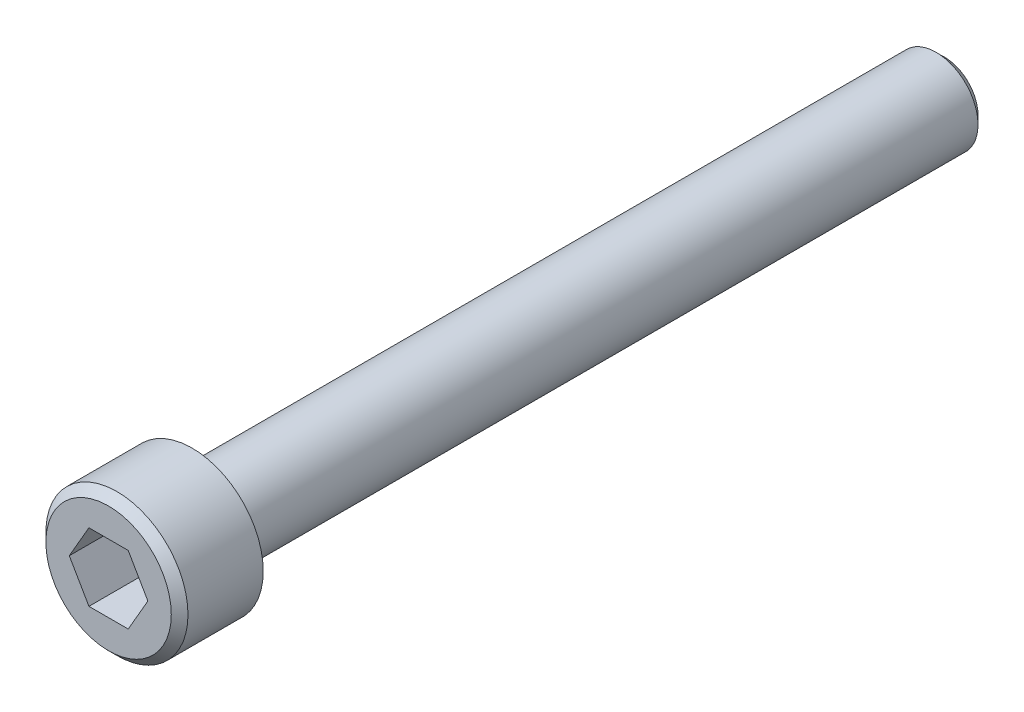
ISO-10303-21;
HEADER;
FILE_DESCRIPTION(('STEP AP214'),'2;1');
FILE_NAME('part.step','',(''),(''),'','','');
FILE_SCHEMA(('AUTOMOTIVE_DESIGN { 1 0 10303 214 1 1 1 1 }'));
ENDSEC;
DATA;
#1=APPLICATION_CONTEXT('core data for automotive mechanical design processes');
#2=APPLICATION_PROTOCOL_DEFINITION('international standard','automotive_design',2000,#1);
#3=PRODUCT_CONTEXT('',#1,'mechanical');
#4=PRODUCT('Part','Part','',(#3));
#5=PRODUCT_RELATED_PRODUCT_CATEGORY('part','',(#4));
#6=PRODUCT_DEFINITION_FORMATION('','',#4);
#7=PRODUCT_DEFINITION_CONTEXT('part definition',#1,'design');
#8=PRODUCT_DEFINITION('design','',#6,#7);
#9=PRODUCT_DEFINITION_SHAPE('','',#8);
#10=(LENGTH_UNIT() NAMED_UNIT(*) SI_UNIT(.MILLI.,.METRE.));
#11=(NAMED_UNIT(*) PLANE_ANGLE_UNIT() SI_UNIT($,.RADIAN.));
#12=(NAMED_UNIT(*) SI_UNIT($,.STERADIAN.) SOLID_ANGLE_UNIT());
#13=UNCERTAINTY_MEASURE_WITH_UNIT(LENGTH_MEASURE(1.E-05),#10,'distance_accuracy_value','');
#14=(GEOMETRIC_REPRESENTATION_CONTEXT(3) GLOBAL_UNCERTAINTY_ASSIGNED_CONTEXT((#13)) GLOBAL_UNIT_ASSIGNED_CONTEXT((#10,
#11,#12)) REPRESENTATION_CONTEXT('',''));
#15=CARTESIAN_POINT('',(0.,0.,0.));
#16=DIRECTION('',(0.,0.,1.));
#17=DIRECTION('',(1.,0.,0.));
#18=AXIS2_PLACEMENT_3D('',#15,#16,#17);
#19=CARTESIAN_POINT('',(0.,0.,0.));
#20=DIRECTION('',(0.,0.,1.));
#21=DIRECTION('',(1.,0.,0.));
#22=AXIS2_PLACEMENT_3D('',#19,#20,#21);
#23=PLANE('',#22);
#24=CARTESIAN_POINT('',(0.,0.,0.));
#25=DIRECTION('',(0.,0.,1.));
#26=DIRECTION('',(1.,0.,0.));
#27=AXIS2_PLACEMENT_3D('',#24,#25,#26);
#28=CIRCLE('',#27,4.25);
#29=CARTESIAN_POINT('',(4.25,0.,0.));
#30=VERTEX_POINT('',#29);
#31=EDGE_CURVE('E134',#30,#30,#28,.T.);
#32=ORIENTED_EDGE('',*,*,#31,.F.);
#33=EDGE_LOOP('',(#32));
#34=FACE_BOUND('',#33,.T.);
#35=CARTESIAN_POINT('',(0.,0.,0.));
#36=DIRECTION('',(0.,0.,1.));
#37=DIRECTION('',(1.,0.,0.));
#38=AXIS2_PLACEMENT_3D('',#35,#36,#37);
#39=CIRCLE('',#38,2.5);
#40=CARTESIAN_POINT('',(2.5,0.,0.));
#41=VERTEX_POINT('',#40);
#42=EDGE_CURVE('E142',#41,#41,#39,.F.);
#43=ORIENTED_EDGE('',*,*,#42,.F.);
#44=EDGE_LOOP('',(#43));
#45=FACE_BOUND('',#44,.T.);
#46=ADVANCED_FACE('F32',(#34,#45),#23,.F.);
#47=CARTESIAN_POINT('',(0.,0.,5.));
#48=DIRECTION('',(0.,0.,-1.));
#49=DIRECTION('',(-1.,0.,0.));
#50=AXIS2_PLACEMENT_3D('',#47,#48,#49);
#51=CYLINDRICAL_SURFACE('',#50,4.25);
#52=CARTESIAN_POINT('',(0.,0.,4.50000000000001));
#53=DIRECTION('',(0.,0.,1.));
#54=DIRECTION('',(1.,0.,0.));
#55=AXIS2_PLACEMENT_3D('',#52,#53,#54);
#56=CIRCLE('',#55,4.25);
#57=CARTESIAN_POINT('',(4.25,0.,4.50000000000001));
#58=VERTEX_POINT('',#57);
#59=EDGE_CURVE('E148',#58,#58,#56,.F.);
#60=ORIENTED_EDGE('',*,*,#59,.T.);
#61=EDGE_LOOP('',(#60));
#62=FACE_BOUND('',#61,.T.);
#63=ORIENTED_EDGE('',*,*,#31,.T.);
#64=EDGE_LOOP('',(#63));
#65=FACE_BOUND('',#64,.T.);
#66=ADVANCED_FACE('F168',(#62,#65),#51,.T.);
#67=CARTESIAN_POINT('',(0.,0.,5.));
#68=DIRECTION('',(0.,0.,1.));
#69=DIRECTION('',(1.,0.,0.));
#70=AXIS2_PLACEMENT_3D('',#67,#68,#69);
#71=PLANE('',#70);
#72=DIRECTION('',(0.499999999999999,0.866025403784439,0.));
#73=VECTOR('',#72,1.);
#74=CARTESIAN_POINT('',(1.175,-2.03515969889343,5.));
#75=LINE('',#74,#73);
#76=CARTESIAN_POINT('',(1.175,-2.03515969889343,5.));
#77=VERTEX_POINT('',#76);
#78=CARTESIAN_POINT('',(2.35,0.,5.));
#79=VERTEX_POINT('',#78);
#80=EDGE_CURVE('E47',#77,#79,#75,.T.);
#81=ORIENTED_EDGE('',*,*,#80,.F.);
#82=DIRECTION('',(1.,0.,0.));
#83=VECTOR('',#82,1.);
#84=CARTESIAN_POINT('',(-1.175,-2.03515969889343,5.));
#85=LINE('',#84,#83);
#86=CARTESIAN_POINT('',(-1.175,-2.03515969889343,5.));
#87=VERTEX_POINT('',#86);
#88=EDGE_CURVE('E130',#87,#77,#85,.T.);
#89=ORIENTED_EDGE('',*,*,#88,.F.);
#90=DIRECTION('',(0.5,-0.866025403784439,0.));
#91=VECTOR('',#90,1.);
#92=CARTESIAN_POINT('',(-2.35,0.,5.));
#93=LINE('',#92,#91);
#94=CARTESIAN_POINT('',(-2.35,0.,5.));
#95=VERTEX_POINT('',#94);
#96=EDGE_CURVE('E128',#95,#87,#93,.T.);
#97=ORIENTED_EDGE('',*,*,#96,.F.);
#98=DIRECTION('',(-0.5,-0.866025403784439,0.));
#99=VECTOR('',#98,1.);
#100=CARTESIAN_POINT('',(-1.175,2.03515969889343,5.));
#101=LINE('',#100,#99);
#102=CARTESIAN_POINT('',(-1.175,2.03515969889343,5.));
#103=VERTEX_POINT('',#102);
#104=EDGE_CURVE('E95',#103,#95,#101,.T.);
#105=ORIENTED_EDGE('',*,*,#104,.F.);
#106=DIRECTION('',(-1.,0.,0.));
#107=VECTOR('',#106,1.);
#108=CARTESIAN_POINT('',(1.175,2.03515969889343,5.));
#109=LINE('',#108,#107);
#110=CARTESIAN_POINT('',(1.175,2.03515969889343,5.));
#111=VERTEX_POINT('',#110);
#112=EDGE_CURVE('E124',#111,#103,#109,.T.);
#113=ORIENTED_EDGE('',*,*,#112,.F.);
#114=DIRECTION('',(-0.5,0.866025403784438,0.));
#115=VECTOR('',#114,1.);
#116=CARTESIAN_POINT('',(2.35,0.,5.));
#117=LINE('',#116,#115);
#118=EDGE_CURVE('E121',#79,#111,#117,.T.);
#119=ORIENTED_EDGE('',*,*,#118,.F.);
#120=EDGE_LOOP('',(#81,#89,#97,#105,#113,#119));
#121=FACE_BOUND('',#120,.T.);
#122=CARTESIAN_POINT('',(0.,0.,5.));
#123=DIRECTION('',(0.,0.,1.));
#124=DIRECTION('',(1.,0.,0.));
#125=AXIS2_PLACEMENT_3D('',#122,#123,#124);
#126=CIRCLE('',#125,3.75000000000002);
#127=CARTESIAN_POINT('',(3.75000000000002,0.,5.));
#128=VERTEX_POINT('',#127);
#129=EDGE_CURVE('E145',#128,#128,#126,.T.);
#130=ORIENTED_EDGE('',*,*,#129,.T.);
#131=EDGE_LOOP('',(#130));
#132=FACE_BOUND('',#131,.T.);
#133=ADVANCED_FACE('F174',(#121,#132),#71,.T.);
#134=CARTESIAN_POINT('',(0.,0.,-45.));
#135=DIRECTION('',(0.,0.,1.));
#136=DIRECTION('',(1.,0.,0.));
#137=AXIS2_PLACEMENT_3D('',#134,#135,#136);
#138=CYLINDRICAL_SURFACE('',#137,2.5);
#139=CARTESIAN_POINT('',(0.,0.,-44.5));
#140=DIRECTION('',(0.,0.,-1.));
#141=DIRECTION('',(-1.,0.,0.));
#142=AXIS2_PLACEMENT_3D('',#139,#140,#141);
#143=CIRCLE('',#142,2.5);
#144=CARTESIAN_POINT('',(2.5,0.,-44.5));
#145=VERTEX_POINT('',#144);
#146=EDGE_CURVE('E11',#145,#145,#143,.F.);
#147=CARTESIAN_POINT('',(2.5,0.,-44.5));
#148=CARTESIAN_POINT('',(2.5,0.,-44.0364583333333));
#149=CARTESIAN_POINT('',(2.5,0.,-43.5729166666667));
#150=CARTESIAN_POINT('',(2.5,0.,-42.6458333333333));
#151=CARTESIAN_POINT('',(2.5,0.,-42.1822916666667));
#152=CARTESIAN_POINT('',(2.5,0.,-41.2552083333333));
#153=CARTESIAN_POINT('',(2.5,0.,-40.7916666666667));
#154=CARTESIAN_POINT('',(2.5,0.,-39.8645833333333));
#155=CARTESIAN_POINT('',(2.5,0.,-39.4010416666667));
#156=CARTESIAN_POINT('',(2.5,0.,-38.4739583333333));
#157=CARTESIAN_POINT('',(2.5,0.,-38.0104166666667));
#158=CARTESIAN_POINT('',(2.5,0.,-37.0833333333333));
#159=CARTESIAN_POINT('',(2.5,0.,-36.6197916666667));
#160=CARTESIAN_POINT('',(2.5,0.,-35.6927083333333));
#161=CARTESIAN_POINT('',(2.5,0.,-35.2291666666667));
#162=CARTESIAN_POINT('',(2.5,0.,-34.3020833333333));
#163=CARTESIAN_POINT('',(2.5,0.,-33.8385416666667));
#164=CARTESIAN_POINT('',(2.5,0.,-32.9114583333333));
#165=CARTESIAN_POINT('',(2.5,0.,-32.4479166666667));
#166=CARTESIAN_POINT('',(2.5,0.,-31.5208333333333));
#167=CARTESIAN_POINT('',(2.5,0.,-31.0572916666667));
#168=CARTESIAN_POINT('',(2.5,0.,-30.1302083333333));
#169=CARTESIAN_POINT('',(2.5,0.,-29.6666666666667));
#170=CARTESIAN_POINT('',(2.5,0.,-28.7395833333333));
#171=CARTESIAN_POINT('',(2.5,0.,-28.2760416666667));
#172=CARTESIAN_POINT('',(2.5,0.,-27.3489583333333));
#173=CARTESIAN_POINT('',(2.5,0.,-26.8854166666667));
#174=CARTESIAN_POINT('',(2.5,0.,-25.9583333333333));
#175=CARTESIAN_POINT('',(2.5,0.,-25.4947916666667));
#176=CARTESIAN_POINT('',(2.5,0.,-24.5677083333333));
#177=CARTESIAN_POINT('',(2.5,0.,-24.1041666666667));
#178=CARTESIAN_POINT('',(2.5,0.,-23.1770833333333));
#179=CARTESIAN_POINT('',(2.5,0.,-22.7135416666667));
#180=CARTESIAN_POINT('',(2.5,0.,-21.7864583333333));
#181=CARTESIAN_POINT('',(2.5,0.,-21.3229166666667));
#182=CARTESIAN_POINT('',(2.5,0.,-20.3958333333333));
#183=CARTESIAN_POINT('',(2.5,0.,-19.9322916666667));
#184=CARTESIAN_POINT('',(2.5,0.,-19.0052083333333));
#185=CARTESIAN_POINT('',(2.5,0.,-18.5416666666667));
#186=CARTESIAN_POINT('',(2.5,0.,-17.6145833333333));
#187=CARTESIAN_POINT('',(2.5,0.,-17.1510416666667));
#188=CARTESIAN_POINT('',(2.5,0.,-16.2239583333333));
#189=CARTESIAN_POINT('',(2.5,0.,-15.7604166666667));
#190=CARTESIAN_POINT('',(2.5,0.,-14.8333333333333));
#191=CARTESIAN_POINT('',(2.5,0.,-14.3697916666667));
#192=CARTESIAN_POINT('',(2.5,0.,-13.4427083333333));
#193=CARTESIAN_POINT('',(2.5,0.,-12.9791666666667));
#194=CARTESIAN_POINT('',(2.5,0.,-12.0520833333333));
#195=CARTESIAN_POINT('',(2.5,0.,-11.5885416666667));
#196=CARTESIAN_POINT('',(2.5,0.,-10.6614583333333));
#197=CARTESIAN_POINT('',(2.5,0.,-10.1979166666667));
#198=CARTESIAN_POINT('',(2.5,0.,-9.27083333333335));
#199=CARTESIAN_POINT('',(2.5,0.,-8.80729166666668));
#200=CARTESIAN_POINT('',(2.5,0.,-7.88020833333335));
#201=CARTESIAN_POINT('',(2.5,0.,-7.41666666666668));
#202=CARTESIAN_POINT('',(2.5,0.,-6.48958333333334));
#203=CARTESIAN_POINT('',(2.5,0.,-6.02604166666667));
#204=CARTESIAN_POINT('',(2.5,0.,-5.09895833333334));
#205=CARTESIAN_POINT('',(2.5,0.,-4.63541666666668));
#206=CARTESIAN_POINT('',(2.5,0.,-3.70833333333334));
#207=CARTESIAN_POINT('',(2.5,0.,-3.24479166666667));
#208=CARTESIAN_POINT('',(2.5,0.,-2.31770833333334));
#209=CARTESIAN_POINT('',(2.5,0.,-1.85416666666668));
#210=CARTESIAN_POINT('',(2.5,0.,-0.927083333333345));
#211=CARTESIAN_POINT('',(2.5,0.,-0.463541666666676));
#212=CARTESIAN_POINT('',(2.5,0.,0.));
#213=B_SPLINE_CURVE_WITH_KNOTS('',3,(#147,#148,#149,#150,#151,#152,#153,#154,#155,#156,#157,
#158,#159,#160,#161,#162,#163,#164,#165,#166,#167,#168,#169,#170,#171,#172,#173,#174,#175,#176,
#177,#178,#179,#180,#181,#182,#183,#184,#185,#186,#187,#188,#189,#190,#191,#192,#193,#194,#195,
#196,#197,#198,#199,#200,#201,#202,#203,#204,#205,#206,#207,#208,#209,#210,#211,#212),
.UNSPECIFIED.,.F.,.F.,(4,2,2,2,2,2,2,2,2,2,2,2,2,2,2,2,2,2,2,2,2,2,2,2,2,2,2,2,2,2,2,2,4),(0.,
1.39062500000001,2.78125000000001,4.17187500000001,5.56250000000001,6.953125,8.34375,9.734375,
11.125,12.515625,13.90625,15.296875,16.6875,18.078125,19.46875,20.859375,22.25,23.640625,
25.03125,26.421875,27.8125,29.203125,30.59375,31.984375,33.375,34.765625,36.15625,37.546875,
38.9375,40.328125,41.71875,43.109375,44.5),.UNSPECIFIED.);
#214=EDGE_CURVE('BSEAM182',#145,#41,#213,.T.);
#215=ORIENTED_EDGE('',*,*,#146,.T.);
#216=ORIENTED_EDGE('',*,*,#42,.T.);
#217=ORIENTED_EDGE('',*,*,#214,.T.);
#218=ORIENTED_EDGE('',*,*,#214,.F.);
#219=EDGE_LOOP('',(#215,#217,#216,#218));
#220=FACE_BOUND('',#219,.T.);
#221=ADVANCED_FACE('F182',(#220),#138,.T.);
#222=CARTESIAN_POINT('',(0.,0.,-45.));
#223=DIRECTION('',(0.,0.,-1.));
#224=DIRECTION('',(-1.,0.,0.));
#225=AXIS2_PLACEMENT_3D('',#222,#223,#224);
#226=PLANE('',#225);
#227=CARTESIAN_POINT('',(0.,0.,-45.));
#228=DIRECTION('',(0.,0.,-1.));
#229=DIRECTION('',(-1.,0.,0.));
#230=AXIS2_PLACEMENT_3D('',#227,#228,#229);
#231=CIRCLE('',#230,2.00000000000002);
#232=CARTESIAN_POINT('',(-2.00000000000002,0.,-45.));
#233=VERTEX_POINT('',#232);
#234=EDGE_CURVE('E40',#233,#233,#231,.T.);
#235=ORIENTED_EDGE('',*,*,#234,.T.);
#236=EDGE_LOOP('',(#235));
#237=FACE_BOUND('',#236,.T.);
#238=ADVANCED_FACE('F153',(#237),#226,.T.);
#239=CARTESIAN_POINT('',(0.,0.,5.));
#240=DIRECTION('',(0.,0.,-1.));
#241=DIRECTION('',(-1.,0.,0.));
#242=AXIS2_PLACEMENT_3D('',#239,#240,#241);
#243=CONICAL_SURFACE('',#242,3.75000000000002,0.785398163397441);
#244=ORIENTED_EDGE('',*,*,#59,.F.);
#245=EDGE_LOOP('',(#244));
#246=FACE_BOUND('',#245,.T.);
#247=ORIENTED_EDGE('',*,*,#129,.F.);
#248=EDGE_LOOP('',(#247));
#249=FACE_BOUND('',#248,.T.);
#250=ADVANCED_FACE('F157',(#246,#249),#243,.T.);
#251=CARTESIAN_POINT('',(0.,0.,-45.));
#252=DIRECTION('',(0.,0.,1.));
#253=DIRECTION('',(1.,0.,0.));
#254=AXIS2_PLACEMENT_3D('',#251,#252,#253);
#255=CONICAL_SURFACE('',#254,2.00000000000002,0.785398163397447);
#256=ORIENTED_EDGE('',*,*,#146,.F.);
#257=EDGE_LOOP('',(#256));
#258=FACE_BOUND('',#257,.T.);
#259=ORIENTED_EDGE('',*,*,#234,.F.);
#260=EDGE_LOOP('',(#259));
#261=FACE_BOUND('',#260,.T.);
#262=ADVANCED_FACE('F34',(#258,#261),#255,.T.);
#263=CARTESIAN_POINT('',(1.175,-2.03515969889343,1.5));
#264=DIRECTION('',(0.866025403784439,-0.499999999999999,0.));
#265=DIRECTION('',(0.5,0.866025403784439,0.));
#266=AXIS2_PLACEMENT_3D('',#263,#264,#265);
#267=PLANE('',#266);
#268=ORIENTED_EDGE('',*,*,#80,.T.);
#269=DIRECTION('',(0.,0.,1.));
#270=VECTOR('',#269,1.);
#271=CARTESIAN_POINT('',(2.35,0.,1.5));
#272=LINE('',#271,#270);
#273=CARTESIAN_POINT('',(2.35,0.,1.5));
#274=VERTEX_POINT('',#273);
#275=EDGE_CURVE('E77',#274,#79,#272,.T.);
#276=ORIENTED_EDGE('',*,*,#275,.F.);
#277=DIRECTION('',(0.499999999999999,0.866025403784439,0.));
#278=VECTOR('',#277,1.);
#279=CARTESIAN_POINT('',(1.175,-2.03515969889343,1.5));
#280=LINE('',#279,#278);
#281=CARTESIAN_POINT('',(1.175,-2.03515969889343,1.5));
#282=VERTEX_POINT('',#281);
#283=EDGE_CURVE('E132',#282,#274,#280,.T.);
#284=ORIENTED_EDGE('',*,*,#283,.F.);
#285=DIRECTION('',(0.,0.,1.));
#286=VECTOR('',#285,1.);
#287=CARTESIAN_POINT('',(1.175,-2.03515969889343,1.5));
#288=LINE('',#287,#286);
#289=EDGE_CURVE('E55',#282,#77,#288,.T.);
#290=ORIENTED_EDGE('',*,*,#289,.T.);
#291=EDGE_LOOP('',(#268,#276,#284,#290));
#292=FACE_BOUND('',#291,.T.);
#293=ADVANCED_FACE('F156',(#292),#267,.F.);
#294=CARTESIAN_POINT('',(-1.175,-2.03515969889343,1.5));
#295=DIRECTION('',(0.,-1.,0.));
#296=DIRECTION('',(1.,0.,0.));
#297=AXIS2_PLACEMENT_3D('',#294,#295,#296);
#298=PLANE('',#297);
#299=ORIENTED_EDGE('',*,*,#88,.T.);
#300=ORIENTED_EDGE('',*,*,#289,.F.);
#301=DIRECTION('',(1.,0.,0.));
#302=VECTOR('',#301,1.);
#303=CARTESIAN_POINT('',(-1.175,-2.03515969889343,1.5));
#304=LINE('',#303,#302);
#305=CARTESIAN_POINT('',(-1.175,-2.03515969889343,1.5));
#306=VERTEX_POINT('',#305);
#307=EDGE_CURVE('E107',#306,#282,#304,.T.);
#308=ORIENTED_EDGE('',*,*,#307,.F.);
#309=DIRECTION('',(0.,0.,1.));
#310=VECTOR('',#309,1.);
#311=CARTESIAN_POINT('',(-1.175,-2.03515969889343,1.5));
#312=LINE('',#311,#310);
#313=EDGE_CURVE('E99',#306,#87,#312,.T.);
#314=ORIENTED_EDGE('',*,*,#313,.T.);
#315=EDGE_LOOP('',(#299,#300,#308,#314));
#316=FACE_BOUND('',#315,.T.);
#317=ADVANCED_FACE('F163',(#316),#298,.F.);
#318=CARTESIAN_POINT('',(-2.35,0.,1.5));
#319=DIRECTION('',(-0.866025403784439,-0.5,0.));
#320=DIRECTION('',(0.5,-0.866025403784439,0.));
#321=AXIS2_PLACEMENT_3D('',#318,#319,#320);
#322=PLANE('',#321);
#323=ORIENTED_EDGE('',*,*,#96,.T.);
#324=ORIENTED_EDGE('',*,*,#313,.F.);
#325=DIRECTION('',(0.5,-0.866025403784439,0.));
#326=VECTOR('',#325,1.);
#327=CARTESIAN_POINT('',(-2.35,0.,1.5));
#328=LINE('',#327,#326);
#329=CARTESIAN_POINT('',(-2.35,0.,1.5));
#330=VERTEX_POINT('',#329);
#331=EDGE_CURVE('E103',#330,#306,#328,.T.);
#332=ORIENTED_EDGE('',*,*,#331,.F.);
#333=DIRECTION('',(0.,0.,1.));
#334=VECTOR('',#333,1.);
#335=CARTESIAN_POINT('',(-2.35,0.,1.5));
#336=LINE('',#335,#334);
#337=EDGE_CURVE('E88',#330,#95,#336,.T.);
#338=ORIENTED_EDGE('',*,*,#337,.T.);
#339=EDGE_LOOP('',(#323,#324,#332,#338));
#340=FACE_BOUND('',#339,.T.);
#341=ADVANCED_FACE('F104',(#340),#322,.F.);
#342=CARTESIAN_POINT('',(-1.175,2.03515969889343,1.5));
#343=DIRECTION('',(-0.866025403784439,0.5,0.));
#344=DIRECTION('',(-0.5,-0.866025403784439,0.));
#345=AXIS2_PLACEMENT_3D('',#342,#343,#344);
#346=PLANE('',#345);
#347=ORIENTED_EDGE('',*,*,#104,.T.);
#348=ORIENTED_EDGE('',*,*,#337,.F.);
#349=DIRECTION('',(-0.5,-0.866025403784439,0.));
#350=VECTOR('',#349,1.);
#351=CARTESIAN_POINT('',(-1.175,2.03515969889343,1.5));
#352=LINE('',#351,#350);
#353=CARTESIAN_POINT('',(-1.175,2.03515969889343,1.5));
#354=VERTEX_POINT('',#353);
#355=EDGE_CURVE('E92',#354,#330,#352,.T.);
#356=ORIENTED_EDGE('',*,*,#355,.F.);
#357=DIRECTION('',(0.,0.,1.));
#358=VECTOR('',#357,1.);
#359=CARTESIAN_POINT('',(-1.175,2.03515969889343,1.5));
#360=LINE('',#359,#358);
#361=EDGE_CURVE('E100',#354,#103,#360,.T.);
#362=ORIENTED_EDGE('',*,*,#361,.T.);
#363=EDGE_LOOP('',(#347,#348,#356,#362));
#364=FACE_BOUND('',#363,.T.);
#365=ADVANCED_FACE('F90',(#364),#346,.F.);
#366=CARTESIAN_POINT('',(1.175,2.03515969889343,1.5));
#367=DIRECTION('',(0.,1.,0.));
#368=DIRECTION('',(0.,0.,1.));
#369=AXIS2_PLACEMENT_3D('',#366,#367,#368);
#370=PLANE('',#369);
#371=ORIENTED_EDGE('',*,*,#112,.T.);
#372=ORIENTED_EDGE('',*,*,#361,.F.);
#373=DIRECTION('',(-1.,0.,0.));
#374=VECTOR('',#373,1.);
#375=CARTESIAN_POINT('',(1.175,2.03515969889343,1.5));
#376=LINE('',#375,#374);
#377=CARTESIAN_POINT('',(1.175,2.03515969889343,1.5));
#378=VERTEX_POINT('',#377);
#379=EDGE_CURVE('E113',#378,#354,#376,.T.);
#380=ORIENTED_EDGE('',*,*,#379,.F.);
#381=DIRECTION('',(0.,0.,1.));
#382=VECTOR('',#381,1.);
#383=CARTESIAN_POINT('',(1.175,2.03515969889343,1.5));
#384=LINE('',#383,#382);
#385=EDGE_CURVE('E137',#378,#111,#384,.T.);
#386=ORIENTED_EDGE('',*,*,#385,.T.);
#387=EDGE_LOOP('',(#371,#372,#380,#386));
#388=FACE_BOUND('',#387,.T.);
#389=ADVANCED_FACE('F192',(#388),#370,.F.);
#390=CARTESIAN_POINT('',(2.35,0.,1.5));
#391=DIRECTION('',(0.866025403784438,0.5,0.));
#392=DIRECTION('',(-0.5,0.866025403784438,0.));
#393=AXIS2_PLACEMENT_3D('',#390,#391,#392);
#394=PLANE('',#393);
#395=ORIENTED_EDGE('',*,*,#118,.T.);
#396=ORIENTED_EDGE('',*,*,#385,.F.);
#397=DIRECTION('',(-0.5,0.866025403784438,0.));
#398=VECTOR('',#397,1.);
#399=CARTESIAN_POINT('',(2.35,0.,1.5));
#400=LINE('',#399,#398);
#401=EDGE_CURVE('E115',#274,#378,#400,.T.);
#402=ORIENTED_EDGE('',*,*,#401,.F.);
#403=ORIENTED_EDGE('',*,*,#275,.T.);
#404=EDGE_LOOP('',(#395,#396,#402,#403));
#405=FACE_BOUND('',#404,.T.);
#406=ADVANCED_FACE('F189',(#405),#394,.F.);
#407=CARTESIAN_POINT('',(0.,0.,1.5));
#408=DIRECTION('',(0.,0.,1.));
#409=DIRECTION('',(1.,0.,0.));
#410=AXIS2_PLACEMENT_3D('',#407,#408,#409);
#411=PLANE('',#410);
#412=ORIENTED_EDGE('',*,*,#283,.T.);
#413=ORIENTED_EDGE('',*,*,#401,.T.);
#414=ORIENTED_EDGE('',*,*,#379,.T.);
#415=ORIENTED_EDGE('',*,*,#355,.T.);
#416=ORIENTED_EDGE('',*,*,#331,.T.);
#417=ORIENTED_EDGE('',*,*,#307,.T.);
#418=EDGE_LOOP('',(#412,#413,#414,#415,#416,#417));
#419=FACE_BOUND('',#418,.T.);
#420=ADVANCED_FACE('F110',(#419),#411,.T.);
#421=CLOSED_SHELL('',(#46,#66,#133,#221,#238,#250,#262,#293,#317,#341,#365,#389,#406,#420));
#422=MANIFOLD_SOLID_BREP('B2',#421);
#423=ADVANCED_BREP_SHAPE_REPRESENTATION('',(#18,#422),#14);
#424=SHAPE_DEFINITION_REPRESENTATION(#9,#423);
ENDSEC;
END-ISO-10303-21;
